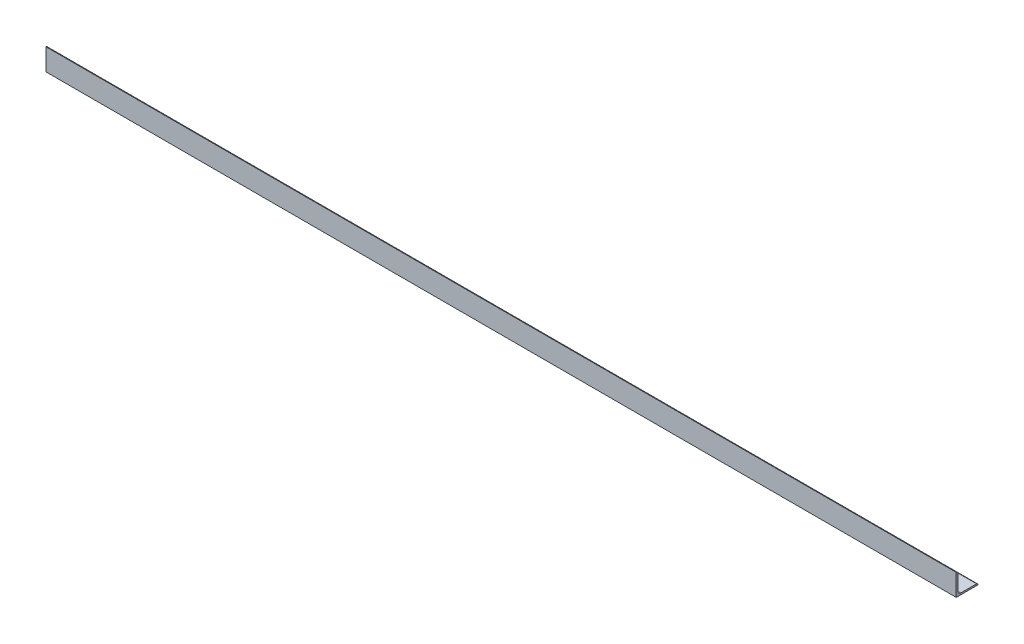
ISO-10303-21;
HEADER;
FILE_DESCRIPTION(('STEP AP214'),'2;1');
FILE_NAME('part.step','',(''),(''),'','','');
FILE_SCHEMA(('AUTOMOTIVE_DESIGN { 1 0 10303 214 1 1 1 1 }'));
ENDSEC;
DATA;
#1=APPLICATION_CONTEXT('core data for automotive mechanical design processes');
#2=APPLICATION_PROTOCOL_DEFINITION('international standard','automotive_design',2000,#1);
#3=PRODUCT_CONTEXT('',#1,'mechanical');
#4=PRODUCT('Part','Part','',(#3));
#5=PRODUCT_RELATED_PRODUCT_CATEGORY('part','',(#4));
#6=PRODUCT_DEFINITION_FORMATION('','',#4);
#7=PRODUCT_DEFINITION_CONTEXT('part definition',#1,'design');
#8=PRODUCT_DEFINITION('design','',#6,#7);
#9=PRODUCT_DEFINITION_SHAPE('','',#8);
#10=(LENGTH_UNIT() NAMED_UNIT(*) SI_UNIT(.MILLI.,.METRE.));
#11=(NAMED_UNIT(*) PLANE_ANGLE_UNIT() SI_UNIT($,.RADIAN.));
#12=(NAMED_UNIT(*) SI_UNIT($,.STERADIAN.) SOLID_ANGLE_UNIT());
#13=UNCERTAINTY_MEASURE_WITH_UNIT(LENGTH_MEASURE(1.E-05),#10,'distance_accuracy_value','');
#14=(GEOMETRIC_REPRESENTATION_CONTEXT(3) GLOBAL_UNCERTAINTY_ASSIGNED_CONTEXT((#13)) GLOBAL_UNIT_ASSIGNED_CONTEXT((#10,
#11,#12)) REPRESENTATION_CONTEXT('',''));
#15=CARTESIAN_POINT('',(0.,0.,0.));
#16=DIRECTION('',(0.,0.,1.));
#17=DIRECTION('',(1.,0.,0.));
#18=AXIS2_PLACEMENT_3D('',#15,#16,#17);
#19=CARTESIAN_POINT('',(1674.,0.,-40.));
#20=DIRECTION('',(0.,1.,0.));
#21=DIRECTION('',(0.,0.,1.));
#22=AXIS2_PLACEMENT_3D('',#19,#20,#21);
#23=PLANE('',#22);
#24=DIRECTION('',(0.,0.,-1.));
#25=VECTOR('',#24,1.);
#26=CARTESIAN_POINT('',(0.,0.,-40.));
#27=LINE('',#26,#25);
#28=CARTESIAN_POINT('',(0.,0.,0.));
#29=VERTEX_POINT('',#28);
#30=CARTESIAN_POINT('',(0.,0.,-40.));
#31=VERTEX_POINT('',#30);
#32=EDGE_CURVE('E160',#29,#31,#27,.T.);
#33=ORIENTED_EDGE('',*,*,#32,.T.);
#34=DIRECTION('',(-1.,0.,0.));
#35=VECTOR('',#34,1.);
#36=CARTESIAN_POINT('',(1674.,0.,-40.));
#37=LINE('',#36,#35);
#38=CARTESIAN_POINT('',(1674.,0.,-40.));
#39=VERTEX_POINT('',#38);
#40=EDGE_CURVE('E13',#39,#31,#37,.T.);
#41=ORIENTED_EDGE('',*,*,#40,.F.);
#42=DIRECTION('',(0.,0.,-1.));
#43=VECTOR('',#42,1.);
#44=CARTESIAN_POINT('',(1674.,0.,-40.));
#45=LINE('',#44,#43);
#46=CARTESIAN_POINT('',(1674.,0.,0.));
#47=VERTEX_POINT('',#46);
#48=EDGE_CURVE('E179',#47,#39,#45,.T.);
#49=ORIENTED_EDGE('',*,*,#48,.F.);
#50=DIRECTION('',(-1.,0.,0.));
#51=VECTOR('',#50,1.);
#52=CARTESIAN_POINT('',(1674.,0.,0.));
#53=LINE('',#52,#51);
#54=EDGE_CURVE('E156',#47,#29,#53,.T.);
#55=ORIENTED_EDGE('',*,*,#54,.T.);
#56=EDGE_LOOP('',(#33,#41,#49,#55));
#57=FACE_BOUND('',#56,.T.);
#58=ADVANCED_FACE('F65',(#57),#23,.F.);
#59=CARTESIAN_POINT('',(1674.,0.,-37.));
#60=DIRECTION('',(-1.,0.,0.));
#61=DIRECTION('',(0.,0.,1.));
#62=AXIS2_PLACEMENT_3D('',#59,#60,#61);
#63=CYLINDRICAL_SURFACE('',#62,3.);
#64=CARTESIAN_POINT('',(0.,0.,-37.));
#65=DIRECTION('',(1.,0.,0.));
#66=DIRECTION('',(0.,0.,-1.));
#67=AXIS2_PLACEMENT_3D('',#64,#65,#66);
#68=CIRCLE('',#67,3.);
#69=CARTESIAN_POINT('',(0.,3.,-37.));
#70=VERTEX_POINT('',#69);
#71=EDGE_CURVE('E164',#31,#70,#68,.T.);
#72=ORIENTED_EDGE('',*,*,#71,.T.);
#73=DIRECTION('',(-1.,0.,0.));
#74=VECTOR('',#73,1.);
#75=CARTESIAN_POINT('',(1674.,3.,-37.));
#76=LINE('',#75,#74);
#77=CARTESIAN_POINT('',(1674.,3.,-37.));
#78=VERTEX_POINT('',#77);
#79=EDGE_CURVE('E74',#78,#70,#76,.T.);
#80=ORIENTED_EDGE('',*,*,#79,.F.);
#81=CARTESIAN_POINT('',(1674.,0.,-37.));
#82=DIRECTION('',(1.,0.,0.));
#83=DIRECTION('',(0.,0.,-1.));
#84=AXIS2_PLACEMENT_3D('',#81,#82,#83);
#85=CIRCLE('',#84,3.);
#86=EDGE_CURVE('E122',#39,#78,#85,.T.);
#87=ORIENTED_EDGE('',*,*,#86,.F.);
#88=ORIENTED_EDGE('',*,*,#40,.T.);
#89=EDGE_LOOP('',(#72,#80,#87,#88));
#90=FACE_BOUND('',#89,.T.);
#91=ADVANCED_FACE('F213',(#90),#63,.T.);
#92=CARTESIAN_POINT('',(1674.,3.,-9.));
#93=DIRECTION('',(0.,-1.,0.));
#94=DIRECTION('',(0.,0.,-1.));
#95=AXIS2_PLACEMENT_3D('',#92,#93,#94);
#96=PLANE('',#95);
#97=DIRECTION('',(0.,0.,1.));
#98=VECTOR('',#97,1.);
#99=CARTESIAN_POINT('',(0.,3.,-9.));
#100=LINE('',#99,#98);
#101=CARTESIAN_POINT('',(0.,3.,-9.00000000000001));
#102=VERTEX_POINT('',#101);
#103=EDGE_CURVE('E167',#70,#102,#100,.T.);
#104=ORIENTED_EDGE('',*,*,#103,.T.);
#105=DIRECTION('',(-1.,0.,0.));
#106=VECTOR('',#105,1.);
#107=CARTESIAN_POINT('',(1674.,3.,-9.00000000000001));
#108=LINE('',#107,#106);
#109=CARTESIAN_POINT('',(1674.,3.,-9.00000000000001));
#110=VERTEX_POINT('',#109);
#111=EDGE_CURVE('E186',#110,#102,#108,.T.);
#112=ORIENTED_EDGE('',*,*,#111,.F.);
#113=DIRECTION('',(0.,0.,1.));
#114=VECTOR('',#113,1.);
#115=CARTESIAN_POINT('',(1674.,3.,-9.));
#116=LINE('',#115,#114);
#117=EDGE_CURVE('E196',#78,#110,#116,.T.);
#118=ORIENTED_EDGE('',*,*,#117,.F.);
#119=ORIENTED_EDGE('',*,*,#79,.T.);
#120=EDGE_LOOP('',(#104,#112,#118,#119));
#121=FACE_BOUND('',#120,.T.);
#122=ADVANCED_FACE('F194',(#121),#96,.F.);
#123=CARTESIAN_POINT('',(1674.,9.,-9.));
#124=DIRECTION('',(-1.,0.,0.));
#125=DIRECTION('',(0.,0.,1.));
#126=AXIS2_PLACEMENT_3D('',#123,#124,#125);
#127=CYLINDRICAL_SURFACE('',#126,6.);
#128=CARTESIAN_POINT('',(0.,9.,-9.));
#129=DIRECTION('',(-1.,0.,0.));
#130=DIRECTION('',(0.,0.,1.));
#131=AXIS2_PLACEMENT_3D('',#128,#129,#130);
#132=CIRCLE('',#131,6.);
#133=CARTESIAN_POINT('',(0.,9.,-3.));
#134=VERTEX_POINT('',#133);
#135=EDGE_CURVE('E170',#102,#134,#132,.T.);
#136=ORIENTED_EDGE('',*,*,#135,.T.);
#137=DIRECTION('',(-1.,0.,0.));
#138=VECTOR('',#137,1.);
#139=CARTESIAN_POINT('',(1674.,9.,-3.));
#140=LINE('',#139,#138);
#141=CARTESIAN_POINT('',(1674.,9.,-3.));
#142=VERTEX_POINT('',#141);
#143=EDGE_CURVE('E149',#142,#134,#140,.T.);
#144=ORIENTED_EDGE('',*,*,#143,.F.);
#145=CARTESIAN_POINT('',(1674.,9.,-9.));
#146=DIRECTION('',(-1.,0.,0.));
#147=DIRECTION('',(0.,0.,1.));
#148=AXIS2_PLACEMENT_3D('',#145,#146,#147);
#149=CIRCLE('',#148,6.);
#150=EDGE_CURVE('E138',#110,#142,#149,.T.);
#151=ORIENTED_EDGE('',*,*,#150,.F.);
#152=ORIENTED_EDGE('',*,*,#111,.T.);
#153=EDGE_LOOP('',(#136,#144,#151,#152));
#154=FACE_BOUND('',#153,.T.);
#155=ADVANCED_FACE('F202',(#154),#127,.F.);
#156=CARTESIAN_POINT('',(1674.,37.,-3.));
#157=DIRECTION('',(0.,0.,1.));
#158=DIRECTION('',(1.,0.,0.));
#159=AXIS2_PLACEMENT_3D('',#156,#157,#158);
#160=PLANE('',#159);
#161=DIRECTION('',(0.,1.,0.));
#162=VECTOR('',#161,1.);
#163=CARTESIAN_POINT('',(0.,37.,-3.));
#164=LINE('',#163,#162);
#165=CARTESIAN_POINT('',(0.,37.,-3.));
#166=VERTEX_POINT('',#165);
#167=EDGE_CURVE('E147',#134,#166,#164,.T.);
#168=ORIENTED_EDGE('',*,*,#167,.T.);
#169=DIRECTION('',(-1.,0.,0.));
#170=VECTOR('',#169,1.);
#171=CARTESIAN_POINT('',(1674.,37.,-3.));
#172=LINE('',#171,#170);
#173=CARTESIAN_POINT('',(1674.,37.,-3.));
#174=VERTEX_POINT('',#173);
#175=EDGE_CURVE('E144',#174,#166,#172,.T.);
#176=ORIENTED_EDGE('',*,*,#175,.F.);
#177=DIRECTION('',(0.,1.,0.));
#178=VECTOR('',#177,1.);
#179=CARTESIAN_POINT('',(1674.,37.,-3.));
#180=LINE('',#179,#178);
#181=EDGE_CURVE('E132',#142,#174,#180,.T.);
#182=ORIENTED_EDGE('',*,*,#181,.F.);
#183=ORIENTED_EDGE('',*,*,#143,.T.);
#184=EDGE_LOOP('',(#168,#176,#182,#183));
#185=FACE_BOUND('',#184,.T.);
#186=ADVANCED_FACE('F145',(#185),#160,.F.);
#187=CARTESIAN_POINT('',(1674.,37.,0.));
#188=DIRECTION('',(-1.,0.,0.));
#189=DIRECTION('',(0.,0.,1.));
#190=AXIS2_PLACEMENT_3D('',#187,#188,#189);
#191=CYLINDRICAL_SURFACE('',#190,3.);
#192=CARTESIAN_POINT('',(0.,37.,0.));
#193=DIRECTION('',(1.,0.,0.));
#194=DIRECTION('',(0.,0.,-1.));
#195=AXIS2_PLACEMENT_3D('',#192,#193,#194);
#196=CIRCLE('',#195,3.);
#197=CARTESIAN_POINT('',(0.,40.,0.));
#198=VERTEX_POINT('',#197);
#199=EDGE_CURVE('E108',#166,#198,#196,.T.);
#200=ORIENTED_EDGE('',*,*,#199,.T.);
#201=DIRECTION('',(-1.,0.,0.));
#202=VECTOR('',#201,1.);
#203=CARTESIAN_POINT('',(1674.,40.,0.));
#204=LINE('',#203,#202);
#205=CARTESIAN_POINT('',(1674.,40.,0.));
#206=VERTEX_POINT('',#205);
#207=EDGE_CURVE('E150',#206,#198,#204,.T.);
#208=ORIENTED_EDGE('',*,*,#207,.F.);
#209=CARTESIAN_POINT('',(1674.,37.,0.));
#210=DIRECTION('',(1.,0.,0.));
#211=DIRECTION('',(0.,0.,-1.));
#212=AXIS2_PLACEMENT_3D('',#209,#210,#211);
#213=CIRCLE('',#212,3.);
#214=EDGE_CURVE('E136',#174,#206,#213,.T.);
#215=ORIENTED_EDGE('',*,*,#214,.F.);
#216=ORIENTED_EDGE('',*,*,#175,.T.);
#217=EDGE_LOOP('',(#200,#208,#215,#216));
#218=FACE_BOUND('',#217,.T.);
#219=ADVANCED_FACE('F152',(#218),#191,.T.);
#220=CARTESIAN_POINT('',(1674.,40.,0.));
#221=DIRECTION('',(0.,0.,-1.));
#222=DIRECTION('',(-1.,0.,0.));
#223=AXIS2_PLACEMENT_3D('',#220,#221,#222);
#224=PLANE('',#223);
#225=DIRECTION('',(0.,-1.,0.));
#226=VECTOR('',#225,1.);
#227=CARTESIAN_POINT('',(0.,40.,0.));
#228=LINE('',#227,#226);
#229=EDGE_CURVE('E114',#198,#29,#228,.T.);
#230=ORIENTED_EDGE('',*,*,#229,.T.);
#231=ORIENTED_EDGE('',*,*,#54,.F.);
#232=DIRECTION('',(0.,-1.,0.));
#233=VECTOR('',#232,1.);
#234=CARTESIAN_POINT('',(1674.,40.,0.));
#235=LINE('',#234,#233);
#236=EDGE_CURVE('E82',#206,#47,#235,.T.);
#237=ORIENTED_EDGE('',*,*,#236,.F.);
#238=ORIENTED_EDGE('',*,*,#207,.T.);
#239=EDGE_LOOP('',(#230,#231,#237,#238));
#240=FACE_BOUND('',#239,.T.);
#241=ADVANCED_FACE('F227',(#240),#224,.F.);
#242=CARTESIAN_POINT('',(1674.,37.,0.));
#243=DIRECTION('',(1.,0.,0.));
#244=DIRECTION('',(0.,0.,-1.));
#245=AXIS2_PLACEMENT_3D('',#242,#243,#244);
#246=PLANE('',#245);
#247=ORIENTED_EDGE('',*,*,#48,.T.);
#248=ORIENTED_EDGE('',*,*,#86,.T.);
#249=ORIENTED_EDGE('',*,*,#117,.T.);
#250=ORIENTED_EDGE('',*,*,#150,.T.);
#251=ORIENTED_EDGE('',*,*,#181,.T.);
#252=ORIENTED_EDGE('',*,*,#214,.T.);
#253=ORIENTED_EDGE('',*,*,#236,.T.);
#254=EDGE_LOOP('',(#247,#248,#249,#250,#251,#252,#253));
#255=FACE_BOUND('',#254,.T.);
#256=ADVANCED_FACE('F134',(#255),#246,.T.);
#257=CARTESIAN_POINT('',(0.,37.,0.));
#258=DIRECTION('',(1.,0.,0.));
#259=DIRECTION('',(0.,0.,-1.));
#260=AXIS2_PLACEMENT_3D('',#257,#258,#259);
#261=PLANE('',#260);
#262=ORIENTED_EDGE('',*,*,#32,.F.);
#263=ORIENTED_EDGE('',*,*,#229,.F.);
#264=ORIENTED_EDGE('',*,*,#199,.F.);
#265=ORIENTED_EDGE('',*,*,#167,.F.);
#266=ORIENTED_EDGE('',*,*,#135,.F.);
#267=ORIENTED_EDGE('',*,*,#103,.F.);
#268=ORIENTED_EDGE('',*,*,#71,.F.);
#269=EDGE_LOOP('',(#262,#263,#264,#265,#266,#267,#268));
#270=FACE_BOUND('',#269,.T.);
#271=ADVANCED_FACE('F200',(#270),#261,.F.);
#272=CLOSED_SHELL('',(#58,#91,#122,#155,#186,#219,#241,#256,#271));
#273=MANIFOLD_SOLID_BREP('B2',#272);
#274=ADVANCED_BREP_SHAPE_REPRESENTATION('',(#18,#273),#14);
#275=SHAPE_DEFINITION_REPRESENTATION(#9,#274);
ENDSEC;
END-ISO-10303-21;
